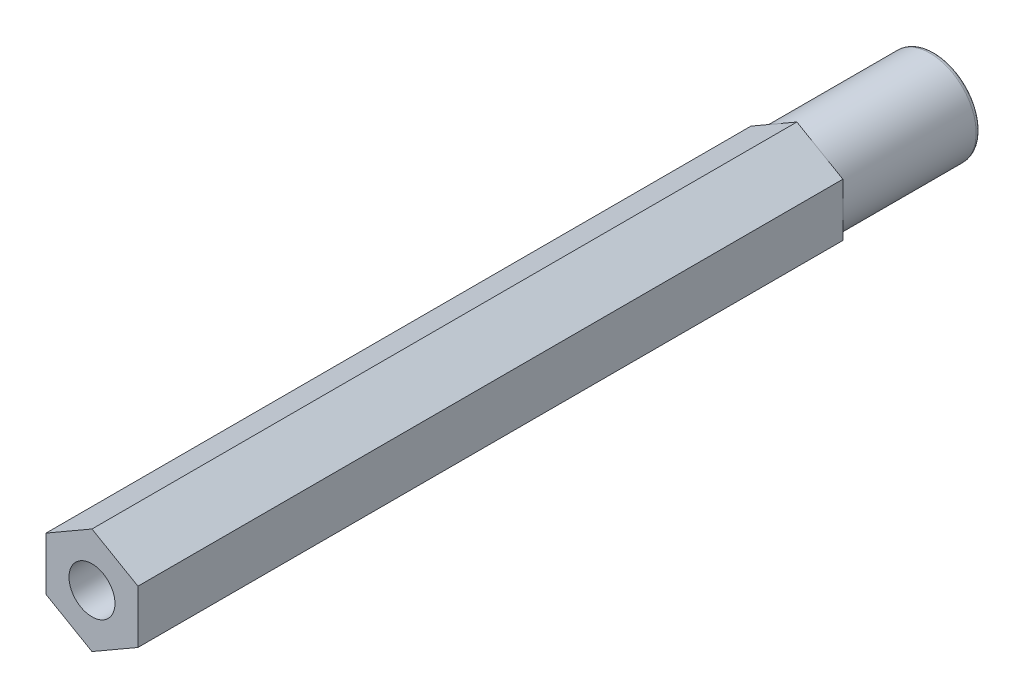
ISO-10303-21;
HEADER;
FILE_DESCRIPTION(('STEP AP214'),'2;1');
FILE_NAME('part.step','',(''),(''),'','','');
FILE_SCHEMA(('AUTOMOTIVE_DESIGN { 1 0 10303 214 1 1 1 1 }'));
ENDSEC;
DATA;
#1=APPLICATION_CONTEXT('core data for automotive mechanical design processes');
#2=APPLICATION_PROTOCOL_DEFINITION('international standard','automotive_design',2000,#1);
#3=PRODUCT_CONTEXT('',#1,'mechanical');
#4=PRODUCT('Part','Part','',(#3));
#5=PRODUCT_RELATED_PRODUCT_CATEGORY('part','',(#4));
#6=PRODUCT_DEFINITION_FORMATION('','',#4);
#7=PRODUCT_DEFINITION_CONTEXT('part definition',#1,'design');
#8=PRODUCT_DEFINITION('design','',#6,#7);
#9=PRODUCT_DEFINITION_SHAPE('','',#8);
#10=(LENGTH_UNIT() NAMED_UNIT(*) SI_UNIT(.MILLI.,.METRE.));
#11=(NAMED_UNIT(*) PLANE_ANGLE_UNIT() SI_UNIT($,.RADIAN.));
#12=(NAMED_UNIT(*) SI_UNIT($,.STERADIAN.) SOLID_ANGLE_UNIT());
#13=UNCERTAINTY_MEASURE_WITH_UNIT(LENGTH_MEASURE(1.E-05),#10,'distance_accuracy_value','');
#14=(GEOMETRIC_REPRESENTATION_CONTEXT(3) GLOBAL_UNCERTAINTY_ASSIGNED_CONTEXT((#13)) GLOBAL_UNIT_ASSIGNED_CONTEXT((#10,
#11,#12)) REPRESENTATION_CONTEXT('',''));
#15=CARTESIAN_POINT('',(0.,0.,0.));
#16=DIRECTION('',(0.,0.,1.));
#17=DIRECTION('',(1.,0.,0.));
#18=AXIS2_PLACEMENT_3D('',#15,#16,#17);
#19=CARTESIAN_POINT('',(0.,0.,0.));
#20=DIRECTION('',(0.,0.,1.));
#21=DIRECTION('',(1.,0.,0.));
#22=AXIS2_PLACEMENT_3D('',#19,#20,#21);
#23=PLANE('',#22);
#24=CARTESIAN_POINT('',(0.,0.,0.));
#25=DIRECTION('',(0.,0.,-1.));
#26=DIRECTION('',(-1.,0.,0.));
#27=AXIS2_PLACEMENT_3D('',#24,#25,#26);
#28=CIRCLE('',#27,1.);
#29=CARTESIAN_POINT('',(-1.,0.,0.));
#30=VERTEX_POINT('',#29);
#31=CARTESIAN_POINT('',(-0.5,0.866025403784436,0.));
#32=VERTEX_POINT('',#31);
#33=EDGE_CURVE('E127',#30,#32,#28,.T.);
#34=ORIENTED_EDGE('',*,*,#33,.F.);
#35=DIRECTION('',(0.,-1.,0.));
#36=VECTOR('',#35,1.);
#37=CARTESIAN_POINT('',(-1.,0.577350269189623,0.));
#38=LINE('',#37,#36);
#39=CARTESIAN_POINT('',(-1.,0.577350269189623,0.));
#40=VERTEX_POINT('',#39);
#41=EDGE_CURVE('E110',#40,#30,#38,.T.);
#42=ORIENTED_EDGE('',*,*,#41,.F.);
#43=DIRECTION('',(-0.866025403784438,-0.500000000000001,0.));
#44=VECTOR('',#43,1.);
#45=CARTESIAN_POINT('',(0.,1.15470053837925,0.));
#46=LINE('',#45,#44);
#47=EDGE_CURVE('E128',#32,#40,#46,.T.);
#48=ORIENTED_EDGE('',*,*,#47,.F.);
#49=EDGE_LOOP('',(#34,#42,#48));
#50=FACE_BOUND('',#49,.T.);
#51=ADVANCED_FACE('F35',(#50),#23,.F.);
#52=CARTESIAN_POINT('',(0.499999999999996,0.866025403784443,0.));
#53=VERTEX_POINT('',#52);
#54=EDGE_CURVE('E50',#32,#53,#28,.T.);
#55=ORIENTED_EDGE('',*,*,#54,.F.);
#56=CARTESIAN_POINT('',(0.,1.15470053837925,0.));
#57=VERTEX_POINT('',#56);
#58=EDGE_CURVE('E125',#57,#32,#46,.T.);
#59=ORIENTED_EDGE('',*,*,#58,.F.);
#60=DIRECTION('',(-0.866025403784442,0.499999999999995,0.));
#61=VECTOR('',#60,1.);
#62=CARTESIAN_POINT('',(0.999999999999992,0.577350269189637,0.));
#63=LINE('',#62,#61);
#64=EDGE_CURVE('E145',#53,#57,#63,.T.);
#65=ORIENTED_EDGE('',*,*,#64,.F.);
#66=EDGE_LOOP('',(#55,#59,#65));
#67=FACE_BOUND('',#66,.T.);
#68=ADVANCED_FACE('F219',(#67),#23,.F.);
#69=CARTESIAN_POINT('',(0.999999999999998,0.,0.));
#70=VERTEX_POINT('',#69);
#71=EDGE_CURVE('E188',#53,#70,#28,.T.);
#72=ORIENTED_EDGE('',*,*,#71,.F.);
#73=CARTESIAN_POINT('',(0.999999999999992,0.577350269189637,0.));
#74=VERTEX_POINT('',#73);
#75=EDGE_CURVE('E163',#74,#53,#63,.T.);
#76=ORIENTED_EDGE('',*,*,#75,.F.);
#77=DIRECTION('',(0.,1.,0.));
#78=VECTOR('',#77,1.);
#79=CARTESIAN_POINT('',(1.,-0.577350269189616,0.));
#80=LINE('',#79,#78);
#81=EDGE_CURVE('E172',#70,#74,#80,.T.);
#82=ORIENTED_EDGE('',*,*,#81,.F.);
#83=EDGE_LOOP('',(#72,#76,#82));
#84=FACE_BOUND('',#83,.T.);
#85=ADVANCED_FACE('F197',(#84),#23,.F.);
#86=CARTESIAN_POINT('',(0.500000000000006,-0.866025403784433,0.));
#87=VERTEX_POINT('',#86);
#88=EDGE_CURVE('E138',#70,#87,#28,.T.);
#89=ORIENTED_EDGE('',*,*,#88,.F.);
#90=CARTESIAN_POINT('',(1.,-0.577350269189616,0.));
#91=VERTEX_POINT('',#90);
#92=EDGE_CURVE('E152',#91,#70,#80,.T.);
#93=ORIENTED_EDGE('',*,*,#92,.F.);
#94=DIRECTION('',(0.866025403784435,0.500000000000007,0.));
#95=VECTOR('',#94,1.);
#96=CARTESIAN_POINT('',(0.,-1.15470053837925,0.));
#97=LINE('',#96,#95);
#98=EDGE_CURVE('E168',#87,#91,#97,.T.);
#99=ORIENTED_EDGE('',*,*,#98,.F.);
#100=EDGE_LOOP('',(#89,#93,#99));
#101=FACE_BOUND('',#100,.T.);
#102=ADVANCED_FACE('F194',(#101),#23,.F.);
#103=CARTESIAN_POINT('',(-0.499999999999994,-0.86602540378444,0.));
#104=VERTEX_POINT('',#103);
#105=EDGE_CURVE('E136',#87,#104,#28,.T.);
#106=ORIENTED_EDGE('',*,*,#105,.F.);
#107=CARTESIAN_POINT('',(0.,-1.15470053837925,0.));
#108=VERTEX_POINT('',#107);
#109=EDGE_CURVE('E169',#108,#87,#97,.T.);
#110=ORIENTED_EDGE('',*,*,#109,.F.);
#111=DIRECTION('',(0.866025403784441,-0.499999999999995,0.));
#112=VECTOR('',#111,1.);
#113=CARTESIAN_POINT('',(-0.999999999999996,-0.57735026918963,0.));
#114=LINE('',#113,#112);
#115=EDGE_CURVE('E120',#104,#108,#114,.T.);
#116=ORIENTED_EDGE('',*,*,#115,.F.);
#117=EDGE_LOOP('',(#106,#110,#116));
#118=FACE_BOUND('',#117,.T.);
#119=ADVANCED_FACE('F209',(#118),#23,.F.);
#120=CARTESIAN_POINT('',(0.999999999999992,0.577350269189637,15.3333333333333));
#121=DIRECTION('',(-0.499999999999995,-0.866025403784441,0.));
#122=DIRECTION('',(0.866025403784442,-0.499999999999995,0.));
#123=AXIS2_PLACEMENT_3D('',#120,#121,#122);
#124=PLANE('',#123);
#125=ORIENTED_EDGE('',*,*,#75,.T.);
#126=ORIENTED_EDGE('',*,*,#64,.T.);
#127=DIRECTION('',(0.,0.,-1.));
#128=VECTOR('',#127,1.);
#129=CARTESIAN_POINT('',(0.,1.15470053837925,15.3333333333333));
#130=LINE('',#129,#128);
#131=CARTESIAN_POINT('',(0.,1.15470053837925,15.3333333333333));
#132=VERTEX_POINT('',#131);
#133=EDGE_CURVE('E137',#132,#57,#130,.T.);
#134=ORIENTED_EDGE('',*,*,#133,.F.);
#135=DIRECTION('',(-0.866025403784442,0.499999999999995,0.));
#136=VECTOR('',#135,1.);
#137=CARTESIAN_POINT('',(0.999999999999992,0.577350269189637,15.3333333333333));
#138=LINE('',#137,#136);
#139=CARTESIAN_POINT('',(0.999999999999992,0.577350269189637,15.3333333333333));
#140=VERTEX_POINT('',#139);
#141=EDGE_CURVE('E148',#140,#132,#138,.T.);
#142=ORIENTED_EDGE('',*,*,#141,.F.);
#143=DIRECTION('',(0.,0.,-1.));
#144=VECTOR('',#143,1.);
#145=CARTESIAN_POINT('',(0.999999999999992,0.577350269189637,15.3333333333333));
#146=LINE('',#145,#144);
#147=EDGE_CURVE('E162',#140,#74,#146,.T.);
#148=ORIENTED_EDGE('',*,*,#147,.T.);
#149=EDGE_LOOP('',(#125,#126,#134,#142,#148));
#150=FACE_BOUND('',#149,.T.);
#151=ADVANCED_FACE('F221',(#150),#124,.F.);
#152=CARTESIAN_POINT('',(0.,1.15470053837925,15.3333333333333));
#153=DIRECTION('',(0.500000000000001,-0.866025403784438,0.));
#154=DIRECTION('',(0.866025403784438,0.500000000000001,0.));
#155=AXIS2_PLACEMENT_3D('',#152,#153,#154);
#156=PLANE('',#155);
#157=ORIENTED_EDGE('',*,*,#58,.T.);
#158=ORIENTED_EDGE('',*,*,#47,.T.);
#159=DIRECTION('',(0.,0.,-1.));
#160=VECTOR('',#159,1.);
#161=CARTESIAN_POINT('',(-1.,0.577350269189623,15.3333333333333));
#162=LINE('',#161,#160);
#163=CARTESIAN_POINT('',(-1.,0.577350269189623,15.3333333333333));
#164=VERTEX_POINT('',#163);
#165=EDGE_CURVE('E117',#164,#40,#162,.T.);
#166=ORIENTED_EDGE('',*,*,#165,.F.);
#167=DIRECTION('',(-0.866025403784438,-0.500000000000001,0.));
#168=VECTOR('',#167,1.);
#169=CARTESIAN_POINT('',(0.,1.15470053837925,15.3333333333333));
#170=LINE('',#169,#168);
#171=EDGE_CURVE('E151',#132,#164,#170,.T.);
#172=ORIENTED_EDGE('',*,*,#171,.F.);
#173=ORIENTED_EDGE('',*,*,#133,.T.);
#174=EDGE_LOOP('',(#157,#158,#166,#172,#173));
#175=FACE_BOUND('',#174,.T.);
#176=ADVANCED_FACE('F218',(#175),#156,.F.);
#177=CARTESIAN_POINT('',(-1.,0.577350269189623,15.3333333333333));
#178=DIRECTION('',(1.,0.,0.));
#179=DIRECTION('',(0.,1.,0.));
#180=AXIS2_PLACEMENT_3D('',#177,#178,#179);
#181=PLANE('',#180);
#182=ORIENTED_EDGE('',*,*,#41,.T.);
#183=CARTESIAN_POINT('',(-0.999999999999996,-0.57735026918963,0.));
#184=VERTEX_POINT('',#183);
#185=EDGE_CURVE('E113',#30,#184,#38,.T.);
#186=ORIENTED_EDGE('',*,*,#185,.T.);
#187=DIRECTION('',(0.,0.,-1.));
#188=VECTOR('',#187,1.);
#189=CARTESIAN_POINT('',(-0.999999999999996,-0.57735026918963,15.3333333333333));
#190=LINE('',#189,#188);
#191=CARTESIAN_POINT('',(-0.999999999999996,-0.57735026918963,15.3333333333333));
#192=VERTEX_POINT('',#191);
#193=EDGE_CURVE('E183',#192,#184,#190,.T.);
#194=ORIENTED_EDGE('',*,*,#193,.F.);
#195=DIRECTION('',(0.,-1.,0.));
#196=VECTOR('',#195,1.);
#197=CARTESIAN_POINT('',(-1.,0.577350269189623,15.3333333333333));
#198=LINE('',#197,#196);
#199=EDGE_CURVE('E154',#164,#192,#198,.T.);
#200=ORIENTED_EDGE('',*,*,#199,.F.);
#201=ORIENTED_EDGE('',*,*,#165,.T.);
#202=EDGE_LOOP('',(#182,#186,#194,#200,#201));
#203=FACE_BOUND('',#202,.T.);
#204=ADVANCED_FACE('F111',(#203),#181,.F.);
#205=CARTESIAN_POINT('',(-0.999999999999996,-0.57735026918963,15.3333333333333));
#206=DIRECTION('',(0.499999999999995,0.866025403784441,0.));
#207=DIRECTION('',(-0.866025403784441,0.499999999999995,0.));
#208=AXIS2_PLACEMENT_3D('',#205,#206,#207);
#209=PLANE('',#208);
#210=EDGE_CURVE('E124',#184,#104,#114,.T.);
#211=ORIENTED_EDGE('',*,*,#210,.T.);
#212=ORIENTED_EDGE('',*,*,#115,.T.);
#213=DIRECTION('',(0.,0.,-1.));
#214=VECTOR('',#213,1.);
#215=CARTESIAN_POINT('',(0.,-1.15470053837925,15.3333333333333));
#216=LINE('',#215,#214);
#217=CARTESIAN_POINT('',(0.,-1.15470053837925,15.3333333333333));
#218=VERTEX_POINT('',#217);
#219=EDGE_CURVE('E180',#218,#108,#216,.T.);
#220=ORIENTED_EDGE('',*,*,#219,.F.);
#221=DIRECTION('',(0.866025403784441,-0.499999999999995,0.));
#222=VECTOR('',#221,1.);
#223=CARTESIAN_POINT('',(-0.999999999999996,-0.57735026918963,15.3333333333333));
#224=LINE('',#223,#222);
#225=EDGE_CURVE('E156',#192,#218,#224,.T.);
#226=ORIENTED_EDGE('',*,*,#225,.F.);
#227=ORIENTED_EDGE('',*,*,#193,.T.);
#228=EDGE_LOOP('',(#211,#212,#220,#226,#227));
#229=FACE_BOUND('',#228,.T.);
#230=ADVANCED_FACE('F211',(#229),#209,.F.);
#231=CARTESIAN_POINT('',(0.,-1.15470053837925,15.3333333333333));
#232=DIRECTION('',(-0.500000000000007,0.866025403784435,0.));
#233=DIRECTION('',(-0.866025403784435,-0.500000000000007,0.));
#234=AXIS2_PLACEMENT_3D('',#231,#232,#233);
#235=PLANE('',#234);
#236=ORIENTED_EDGE('',*,*,#109,.T.);
#237=ORIENTED_EDGE('',*,*,#98,.T.);
#238=DIRECTION('',(0.,0.,-1.));
#239=VECTOR('',#238,1.);
#240=CARTESIAN_POINT('',(1.,-0.577350269189616,15.3333333333333));
#241=LINE('',#240,#239);
#242=CARTESIAN_POINT('',(1.,-0.577350269189616,15.3333333333333));
#243=VERTEX_POINT('',#242);
#244=EDGE_CURVE('E177',#243,#91,#241,.T.);
#245=ORIENTED_EDGE('',*,*,#244,.F.);
#246=DIRECTION('',(0.866025403784435,0.500000000000007,0.));
#247=VECTOR('',#246,1.);
#248=CARTESIAN_POINT('',(0.,-1.15470053837925,15.3333333333333));
#249=LINE('',#248,#247);
#250=EDGE_CURVE('E158',#218,#243,#249,.T.);
#251=ORIENTED_EDGE('',*,*,#250,.F.);
#252=ORIENTED_EDGE('',*,*,#219,.T.);
#253=EDGE_LOOP('',(#236,#237,#245,#251,#252));
#254=FACE_BOUND('',#253,.T.);
#255=ADVANCED_FACE('F205',(#254),#235,.F.);
#256=CARTESIAN_POINT('',(1.,-0.577350269189616,15.3333333333333));
#257=DIRECTION('',(-1.,0.,0.));
#258=DIRECTION('',(0.,-1.,0.));
#259=AXIS2_PLACEMENT_3D('',#256,#257,#258);
#260=PLANE('',#259);
#261=ORIENTED_EDGE('',*,*,#92,.T.);
#262=ORIENTED_EDGE('',*,*,#81,.T.);
#263=ORIENTED_EDGE('',*,*,#147,.F.);
#264=DIRECTION('',(0.,1.,0.));
#265=VECTOR('',#264,1.);
#266=CARTESIAN_POINT('',(1.,-0.577350269189616,15.3333333333333));
#267=LINE('',#266,#265);
#268=EDGE_CURVE('E160',#243,#140,#267,.T.);
#269=ORIENTED_EDGE('',*,*,#268,.F.);
#270=ORIENTED_EDGE('',*,*,#244,.T.);
#271=EDGE_LOOP('',(#261,#262,#263,#269,#270));
#272=FACE_BOUND('',#271,.T.);
#273=ADVANCED_FACE('F200',(#272),#260,.F.);
#274=CARTESIAN_POINT('',(0.,0.,15.3333333333333));
#275=DIRECTION('',(0.,0.,1.));
#276=DIRECTION('',(1.,0.,0.));
#277=AXIS2_PLACEMENT_3D('',#274,#275,#276);
#278=PLANE('',#277);
#279=CARTESIAN_POINT('',(0.,0.,15.3333333333333));
#280=DIRECTION('',(0.,0.,1.));
#281=DIRECTION('',(1.,0.,0.));
#282=AXIS2_PLACEMENT_3D('',#279,#280,#281);
#283=CIRCLE('',#282,0.5);
#284=CARTESIAN_POINT('',(0.5,0.,15.3333333333333));
#285=VERTEX_POINT('',#284);
#286=EDGE_CURVE('E131',#285,#285,#283,.T.);
#287=ORIENTED_EDGE('',*,*,#286,.F.);
#288=EDGE_LOOP('',(#287));
#289=FACE_BOUND('',#288,.T.);
#290=ORIENTED_EDGE('',*,*,#141,.T.);
#291=ORIENTED_EDGE('',*,*,#171,.T.);
#292=ORIENTED_EDGE('',*,*,#199,.T.);
#293=ORIENTED_EDGE('',*,*,#225,.T.);
#294=ORIENTED_EDGE('',*,*,#250,.T.);
#295=ORIENTED_EDGE('',*,*,#268,.T.);
#296=EDGE_LOOP('',(#290,#291,#292,#293,#294,#295));
#297=FACE_BOUND('',#296,.T.);
#298=ADVANCED_FACE('F214',(#289,#297),#278,.T.);
#299=EDGE_CURVE('E58',#104,#30,#28,.T.);
#300=ORIENTED_EDGE('',*,*,#299,.F.);
#301=ORIENTED_EDGE('',*,*,#210,.F.);
#302=ORIENTED_EDGE('',*,*,#185,.F.);
#303=EDGE_LOOP('',(#300,#301,#302));
#304=FACE_BOUND('',#303,.T.);
#305=ADVANCED_FACE('F122',(#304),#23,.F.);
#306=CARTESIAN_POINT('',(0.,0.,13.3333333333333));
#307=DIRECTION('',(0.,0.,1.));
#308=DIRECTION('',(1.,0.,0.));
#309=AXIS2_PLACEMENT_3D('',#306,#307,#308);
#310=CYLINDRICAL_SURFACE('',#309,0.5);
#311=CARTESIAN_POINT('',(0.,0.,13.3333333333333));
#312=DIRECTION('',(0.,0.,1.));
#313=DIRECTION('',(1.,0.,0.));
#314=AXIS2_PLACEMENT_3D('',#311,#312,#313);
#315=CIRCLE('',#314,0.5);
#316=CARTESIAN_POINT('',(0.5,0.,13.3333333333333));
#317=VERTEX_POINT('',#316);
#318=EDGE_CURVE('E142',#317,#317,#315,.T.);
#319=ORIENTED_EDGE('',*,*,#318,.F.);
#320=EDGE_LOOP('',(#319));
#321=FACE_BOUND('',#320,.T.);
#322=ORIENTED_EDGE('',*,*,#286,.T.);
#323=EDGE_LOOP('',(#322));
#324=FACE_BOUND('',#323,.T.);
#325=ADVANCED_FACE('F236',(#321,#324),#310,.F.);
#326=CARTESIAN_POINT('',(0.,0.,13.3333333333333));
#327=DIRECTION('',(0.,0.,1.));
#328=DIRECTION('',(1.,0.,0.));
#329=AXIS2_PLACEMENT_3D('',#326,#327,#328);
#330=PLANE('',#329);
#331=ORIENTED_EDGE('',*,*,#318,.T.);
#332=EDGE_LOOP('',(#331));
#333=FACE_BOUND('',#332,.T.);
#334=ADVANCED_FACE('F241',(#333),#330,.T.);
#335=CARTESIAN_POINT('',(0.,0.,-3.));
#336=DIRECTION('',(0.,0.,1.));
#337=DIRECTION('',(1.,0.,0.));
#338=AXIS2_PLACEMENT_3D('',#335,#336,#337);
#339=CYLINDRICAL_SURFACE('',#338,1.);
#340=CARTESIAN_POINT('',(0.,0.,-2.9));
#341=DIRECTION('',(0.,0.,-1.));
#342=DIRECTION('',(-1.,0.,0.));
#343=AXIS2_PLACEMENT_3D('',#340,#341,#342);
#344=CIRCLE('',#343,1.);
#345=CARTESIAN_POINT('',(-1.,0.,-2.9));
#346=VERTEX_POINT('',#345);
#347=EDGE_CURVE('E11',#346,#346,#344,.F.);
#348=ORIENTED_EDGE('',*,*,#347,.T.);
#349=EDGE_LOOP('',(#348));
#350=FACE_BOUND('',#349,.T.);
#351=ORIENTED_EDGE('',*,*,#33,.T.);
#352=ORIENTED_EDGE('',*,*,#54,.T.);
#353=ORIENTED_EDGE('',*,*,#71,.T.);
#354=ORIENTED_EDGE('',*,*,#88,.T.);
#355=ORIENTED_EDGE('',*,*,#105,.T.);
#356=ORIENTED_EDGE('',*,*,#299,.T.);
#357=EDGE_LOOP('',(#351,#352,#353,#354,#355,#356));
#358=FACE_BOUND('',#357,.T.);
#359=ADVANCED_FACE('F134',(#350,#358),#339,.T.);
#360=CARTESIAN_POINT('',(0.,0.,-3.));
#361=DIRECTION('',(0.,0.,-1.));
#362=DIRECTION('',(-1.,0.,0.));
#363=AXIS2_PLACEMENT_3D('',#360,#361,#362);
#364=PLANE('',#363);
#365=CARTESIAN_POINT('',(0.,0.,-3.));
#366=DIRECTION('',(0.,0.,-1.));
#367=DIRECTION('',(-1.,0.,0.));
#368=AXIS2_PLACEMENT_3D('',#365,#366,#367);
#369=CIRCLE('',#368,0.9);
#370=CARTESIAN_POINT('',(-0.9,0.,-3.));
#371=VERTEX_POINT('',#370);
#372=EDGE_CURVE('E43',#371,#371,#369,.T.);
#373=ORIENTED_EDGE('',*,*,#372,.T.);
#374=EDGE_LOOP('',(#373));
#375=FACE_BOUND('',#374,.T.);
#376=ADVANCED_FACE('F255',(#375),#364,.T.);
#377=CARTESIAN_POINT('',(0.,0.,-2.9));
#378=DIRECTION('',(0.,0.,-1.));
#379=DIRECTION('',(-1.,0.,0.));
#380=AXIS2_PLACEMENT_3D('',#377,#378,#379);
#381=TOROIDAL_SURFACE('',#380,0.9,0.1);
#382=ORIENTED_EDGE('',*,*,#347,.F.);
#383=EDGE_LOOP('',(#382));
#384=FACE_BOUND('',#383,.T.);
#385=ORIENTED_EDGE('',*,*,#372,.F.);
#386=EDGE_LOOP('',(#385));
#387=FACE_BOUND('',#386,.T.);
#388=ADVANCED_FACE('F37',(#384,#387),#381,.T.);
#389=CLOSED_SHELL('',(#51,#68,#85,#102,#119,#151,#176,#204,#230,#255,#273,#298,#305,#325,#334,
#359,#376,#388));
#390=MANIFOLD_SOLID_BREP('B2',#389);
#391=ADVANCED_BREP_SHAPE_REPRESENTATION('',(#18,#390),#14);
#392=SHAPE_DEFINITION_REPRESENTATION(#9,#391);
ENDSEC;
END-ISO-10303-21;
